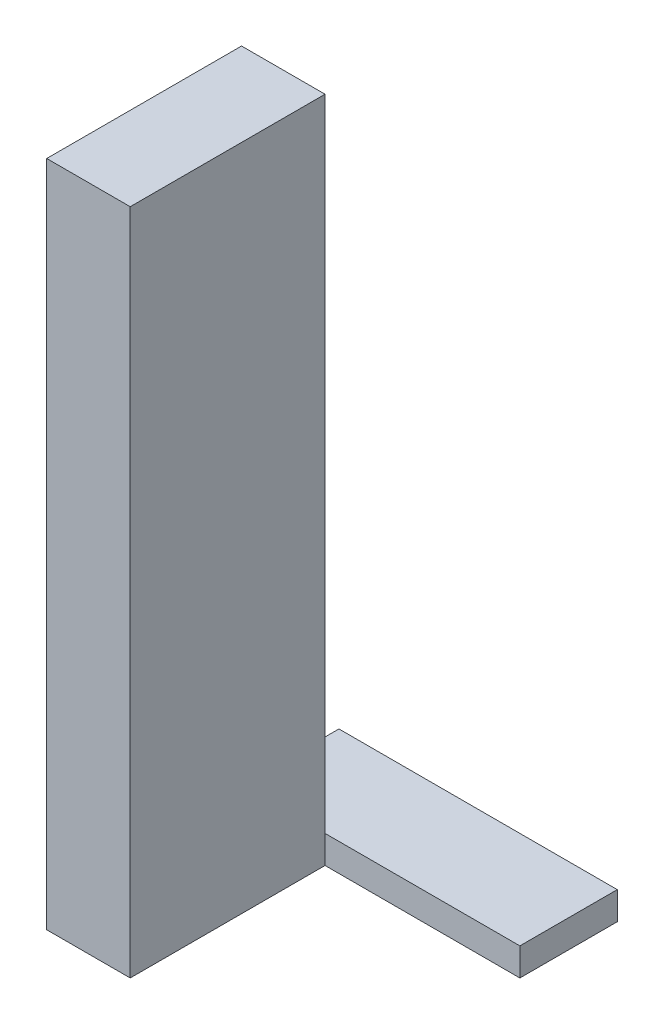
ISO-10303-21;
HEADER;
FILE_DESCRIPTION(('STEP AP214'),'2;1');
FILE_NAME('part.step','',(''),(''),'','','');
FILE_SCHEMA(('AUTOMOTIVE_DESIGN { 1 0 10303 214 1 1 1 1 }'));
ENDSEC;
DATA;
#1=APPLICATION_CONTEXT('core data for automotive mechanical design processes');
#2=APPLICATION_PROTOCOL_DEFINITION('international standard','automotive_design',2000,#1);
#3=PRODUCT_CONTEXT('',#1,'mechanical');
#4=PRODUCT('Part','Part','',(#3));
#5=PRODUCT_RELATED_PRODUCT_CATEGORY('part','',(#4));
#6=PRODUCT_DEFINITION_FORMATION('','',#4);
#7=PRODUCT_DEFINITION_CONTEXT('part definition',#1,'design');
#8=PRODUCT_DEFINITION('design','',#6,#7);
#9=PRODUCT_DEFINITION_SHAPE('','',#8);
#10=(LENGTH_UNIT() NAMED_UNIT(*) SI_UNIT(.MILLI.,.METRE.));
#11=(NAMED_UNIT(*) PLANE_ANGLE_UNIT() SI_UNIT($,.RADIAN.));
#12=(NAMED_UNIT(*) SI_UNIT($,.STERADIAN.) SOLID_ANGLE_UNIT());
#13=UNCERTAINTY_MEASURE_WITH_UNIT(LENGTH_MEASURE(1.E-05),#10,'distance_accuracy_value','');
#14=(GEOMETRIC_REPRESENTATION_CONTEXT(3) GLOBAL_UNCERTAINTY_ASSIGNED_CONTEXT((#13)) GLOBAL_UNIT_ASSIGNED_CONTEXT((#10,
#11,#12)) REPRESENTATION_CONTEXT('',''));
#15=CARTESIAN_POINT('',(0.,0.,0.));
#16=DIRECTION('',(0.,0.,1.));
#17=DIRECTION('',(1.,0.,0.));
#18=AXIS2_PLACEMENT_3D('',#15,#16,#17);
#19=CARTESIAN_POINT('',(40.,390.,484.));
#20=DIRECTION('',(0.,0.,-1.));
#21=DIRECTION('',(-1.,0.,0.));
#22=AXIS2_PLACEMENT_3D('',#19,#20,#21);
#23=PLANE('',#22);
#24=DIRECTION('',(0.,-1.,0.));
#25=VECTOR('',#24,1.);
#26=CARTESIAN_POINT('',(0.,390.,484.));
#27=LINE('',#26,#25);
#28=CARTESIAN_POINT('',(0.,394.,484.));
#29=VERTEX_POINT('',#28);
#30=CARTESIAN_POINT('',(0.,390.,484.));
#31=VERTEX_POINT('',#30);
#32=EDGE_CURVE('E112',#29,#31,#27,.T.);
#33=ORIENTED_EDGE('',*,*,#32,.T.);
#34=DIRECTION('',(-1.,0.,0.));
#35=VECTOR('',#34,1.);
#36=CARTESIAN_POINT('',(40.,390.,484.));
#37=LINE('',#36,#35);
#38=CARTESIAN_POINT('',(40.,390.,484.));
#39=VERTEX_POINT('',#38);
#40=EDGE_CURVE('E12',#39,#31,#37,.T.);
#41=ORIENTED_EDGE('',*,*,#40,.F.);
#42=DIRECTION('',(0.,-1.,0.));
#43=VECTOR('',#42,1.);
#44=CARTESIAN_POINT('',(40.,390.,484.));
#45=LINE('',#44,#43);
#46=CARTESIAN_POINT('',(40.,394.,484.));
#47=VERTEX_POINT('',#46);
#48=EDGE_CURVE('E100',#47,#39,#45,.T.);
#49=ORIENTED_EDGE('',*,*,#48,.F.);
#50=DIRECTION('',(-1.,0.,0.));
#51=VECTOR('',#50,1.);
#52=CARTESIAN_POINT('',(40.,394.,484.));
#53=LINE('',#52,#51);
#54=EDGE_CURVE('E108',#47,#29,#53,.T.);
#55=ORIENTED_EDGE('',*,*,#54,.T.);
#56=EDGE_LOOP('',(#33,#41,#49,#55));
#57=FACE_BOUND('',#56,.T.);
#58=ADVANCED_FACE('F49',(#57),#23,.F.);
#59=CARTESIAN_POINT('',(40.,390.,470.));
#60=DIRECTION('',(0.,1.,0.));
#61=DIRECTION('',(0.,0.,1.));
#62=AXIS2_PLACEMENT_3D('',#59,#60,#61);
#63=PLANE('',#62);
#64=DIRECTION('',(0.,0.,-1.));
#65=VECTOR('',#64,1.);
#66=CARTESIAN_POINT('',(0.,390.,470.));
#67=LINE('',#66,#65);
#68=CARTESIAN_POINT('',(0.,390.,470.));
#69=VERTEX_POINT('',#68);
#70=EDGE_CURVE('E104',#31,#69,#67,.T.);
#71=ORIENTED_EDGE('',*,*,#70,.T.);
#72=DIRECTION('',(-1.,0.,0.));
#73=VECTOR('',#72,1.);
#74=CARTESIAN_POINT('',(40.,390.,470.));
#75=LINE('',#74,#73);
#76=CARTESIAN_POINT('',(40.,390.,470.));
#77=VERTEX_POINT('',#76);
#78=EDGE_CURVE('E57',#77,#69,#75,.T.);
#79=ORIENTED_EDGE('',*,*,#78,.F.);
#80=DIRECTION('',(0.,0.,-1.));
#81=VECTOR('',#80,1.);
#82=CARTESIAN_POINT('',(40.,390.,470.));
#83=LINE('',#82,#81);
#84=EDGE_CURVE('E95',#39,#77,#83,.T.);
#85=ORIENTED_EDGE('',*,*,#84,.F.);
#86=ORIENTED_EDGE('',*,*,#40,.T.);
#87=EDGE_LOOP('',(#71,#79,#85,#86));
#88=FACE_BOUND('',#87,.T.);
#89=ADVANCED_FACE('F103',(#88),#63,.F.);
#90=CARTESIAN_POINT('',(40.,390.,470.));
#91=DIRECTION('',(0.,0.,1.));
#92=DIRECTION('',(1.,0.,0.));
#93=AXIS2_PLACEMENT_3D('',#90,#91,#92);
#94=PLANE('',#93);
#95=DIRECTION('',(0.,1.,0.));
#96=VECTOR('',#95,1.);
#97=CARTESIAN_POINT('',(0.,390.,470.));
#98=LINE('',#97,#96);
#99=CARTESIAN_POINT('',(0.,394.,470.));
#100=VERTEX_POINT('',#99);
#101=EDGE_CURVE('E82',#69,#100,#98,.T.);
#102=ORIENTED_EDGE('',*,*,#101,.T.);
#103=DIRECTION('',(-1.,0.,0.));
#104=VECTOR('',#103,1.);
#105=CARTESIAN_POINT('',(40.,394.,470.));
#106=LINE('',#105,#104);
#107=CARTESIAN_POINT('',(40.,394.,470.));
#108=VERTEX_POINT('',#107);
#109=EDGE_CURVE('E105',#108,#100,#106,.T.);
#110=ORIENTED_EDGE('',*,*,#109,.F.);
#111=DIRECTION('',(0.,1.,0.));
#112=VECTOR('',#111,1.);
#113=CARTESIAN_POINT('',(40.,390.,470.));
#114=LINE('',#113,#112);
#115=EDGE_CURVE('E98',#77,#108,#114,.T.);
#116=ORIENTED_EDGE('',*,*,#115,.F.);
#117=ORIENTED_EDGE('',*,*,#78,.T.);
#118=EDGE_LOOP('',(#102,#110,#116,#117));
#119=FACE_BOUND('',#118,.T.);
#120=ADVANCED_FACE('F106',(#119),#94,.F.);
#121=CARTESIAN_POINT('',(40.,394.,470.));
#122=DIRECTION('',(0.,-1.,0.));
#123=DIRECTION('',(0.,0.,-1.));
#124=AXIS2_PLACEMENT_3D('',#121,#122,#123);
#125=PLANE('',#124);
#126=DIRECTION('',(0.,0.,1.));
#127=VECTOR('',#126,1.);
#128=CARTESIAN_POINT('',(0.,394.,470.));
#129=LINE('',#128,#127);
#130=EDGE_CURVE('E88',#100,#29,#129,.T.);
#131=ORIENTED_EDGE('',*,*,#130,.T.);
#132=ORIENTED_EDGE('',*,*,#54,.F.);
#133=DIRECTION('',(0.,0.,1.));
#134=VECTOR('',#133,1.);
#135=CARTESIAN_POINT('',(40.,394.,470.));
#136=LINE('',#135,#134);
#137=EDGE_CURVE('E65',#108,#47,#136,.T.);
#138=ORIENTED_EDGE('',*,*,#137,.F.);
#139=ORIENTED_EDGE('',*,*,#109,.T.);
#140=EDGE_LOOP('',(#131,#132,#138,#139));
#141=FACE_BOUND('',#140,.T.);
#142=ADVANCED_FACE('F119',(#141),#125,.F.);
#143=CARTESIAN_POINT('',(40.,0.,0.));
#144=DIRECTION('',(1.,0.,0.));
#145=DIRECTION('',(0.,0.,-1.));
#146=AXIS2_PLACEMENT_3D('',#143,#144,#145);
#147=PLANE('',#146);
#148=ORIENTED_EDGE('',*,*,#48,.T.);
#149=ORIENTED_EDGE('',*,*,#84,.T.);
#150=ORIENTED_EDGE('',*,*,#115,.T.);
#151=ORIENTED_EDGE('',*,*,#137,.T.);
#152=EDGE_LOOP('',(#148,#149,#150,#151));
#153=FACE_BOUND('',#152,.T.);
#154=ADVANCED_FACE('F96',(#153),#147,.T.);
#155=CARTESIAN_POINT('',(0.,0.,0.));
#156=DIRECTION('',(1.,0.,0.));
#157=DIRECTION('',(0.,0.,-1.));
#158=AXIS2_PLACEMENT_3D('',#155,#156,#157);
#159=PLANE('',#158);
#160=ORIENTED_EDGE('',*,*,#32,.F.);
#161=ORIENTED_EDGE('',*,*,#130,.F.);
#162=ORIENTED_EDGE('',*,*,#101,.F.);
#163=ORIENTED_EDGE('',*,*,#70,.F.);
#164=EDGE_LOOP('',(#160,#161,#162,#163));
#165=FACE_BOUND('',#164,.T.);
#166=ADVANCED_FACE('F122',(#165),#159,.F.);
#167=CLOSED_SHELL('',(#58,#89,#120,#142,#154,#166));
#168=MANIFOLD_SOLID_BREP('B2',#167);
#169=CARTESIAN_POINT('',(12.,390.,512.));
#170=DIRECTION('',(0.,0.,-1.));
#171=DIRECTION('',(-1.,0.,0.));
#172=AXIS2_PLACEMENT_3D('',#169,#170,#171);
#173=PLANE('',#172);
#174=DIRECTION('',(0.,-1.,0.));
#175=VECTOR('',#174,1.);
#176=CARTESIAN_POINT('',(0.,390.,512.));
#177=LINE('',#176,#175);
#178=CARTESIAN_POINT('',(0.,486.,512.));
#179=VERTEX_POINT('',#178);
#180=CARTESIAN_POINT('',(0.,390.,512.));
#181=VERTEX_POINT('',#180);
#182=EDGE_CURVE('E236',#179,#181,#177,.T.);
#183=ORIENTED_EDGE('',*,*,#182,.T.);
#184=DIRECTION('',(-1.,0.,0.));
#185=VECTOR('',#184,1.);
#186=CARTESIAN_POINT('',(12.,390.,512.));
#187=LINE('',#186,#185);
#188=CARTESIAN_POINT('',(12.,390.,512.));
#189=VERTEX_POINT('',#188);
#190=EDGE_CURVE('E47',#189,#181,#187,.T.);
#191=ORIENTED_EDGE('',*,*,#190,.F.);
#192=DIRECTION('',(0.,-1.,0.));
#193=VECTOR('',#192,1.);
#194=CARTESIAN_POINT('',(12.,390.,512.));
#195=LINE('',#194,#193);
#196=CARTESIAN_POINT('',(12.,486.,512.));
#197=VERTEX_POINT('',#196);
#198=EDGE_CURVE('E224',#197,#189,#195,.T.);
#199=ORIENTED_EDGE('',*,*,#198,.F.);
#200=DIRECTION('',(-1.,0.,0.));
#201=VECTOR('',#200,1.);
#202=CARTESIAN_POINT('',(12.,486.,512.));
#203=LINE('',#202,#201);
#204=EDGE_CURVE('E232',#197,#179,#203,.T.);
#205=ORIENTED_EDGE('',*,*,#204,.T.);
#206=EDGE_LOOP('',(#183,#191,#199,#205));
#207=FACE_BOUND('',#206,.T.);
#208=ADVANCED_FACE('F173',(#207),#173,.F.);
#209=CARTESIAN_POINT('',(12.,390.,484.));
#210=DIRECTION('',(0.,1.,0.));
#211=DIRECTION('',(0.,0.,1.));
#212=AXIS2_PLACEMENT_3D('',#209,#210,#211);
#213=PLANE('',#212);
#214=DIRECTION('',(0.,0.,-1.));
#215=VECTOR('',#214,1.);
#216=CARTESIAN_POINT('',(0.,390.,484.));
#217=LINE('',#216,#215);
#218=CARTESIAN_POINT('',(0.,390.,484.));
#219=VERTEX_POINT('',#218);
#220=EDGE_CURVE('E228',#181,#219,#217,.T.);
#221=ORIENTED_EDGE('',*,*,#220,.T.);
#222=DIRECTION('',(-1.,0.,0.));
#223=VECTOR('',#222,1.);
#224=CARTESIAN_POINT('',(12.,390.,484.));
#225=LINE('',#224,#223);
#226=CARTESIAN_POINT('',(12.,390.,484.));
#227=VERTEX_POINT('',#226);
#228=EDGE_CURVE('E181',#227,#219,#225,.T.);
#229=ORIENTED_EDGE('',*,*,#228,.F.);
#230=DIRECTION('',(0.,0.,-1.));
#231=VECTOR('',#230,1.);
#232=CARTESIAN_POINT('',(12.,390.,484.));
#233=LINE('',#232,#231);
#234=EDGE_CURVE('E219',#189,#227,#233,.T.);
#235=ORIENTED_EDGE('',*,*,#234,.F.);
#236=ORIENTED_EDGE('',*,*,#190,.T.);
#237=EDGE_LOOP('',(#221,#229,#235,#236));
#238=FACE_BOUND('',#237,.T.);
#239=ADVANCED_FACE('F227',(#238),#213,.F.);
#240=CARTESIAN_POINT('',(12.,390.,484.));
#241=DIRECTION('',(0.,0.,1.));
#242=DIRECTION('',(1.,0.,0.));
#243=AXIS2_PLACEMENT_3D('',#240,#241,#242);
#244=PLANE('',#243);
#245=DIRECTION('',(0.,1.,0.));
#246=VECTOR('',#245,1.);
#247=CARTESIAN_POINT('',(0.,390.,484.));
#248=LINE('',#247,#246);
#249=CARTESIAN_POINT('',(0.,486.,484.));
#250=VERTEX_POINT('',#249);
#251=EDGE_CURVE('E206',#219,#250,#248,.T.);
#252=ORIENTED_EDGE('',*,*,#251,.T.);
#253=DIRECTION('',(-1.,0.,0.));
#254=VECTOR('',#253,1.);
#255=CARTESIAN_POINT('',(12.,486.,484.));
#256=LINE('',#255,#254);
#257=CARTESIAN_POINT('',(12.,486.,484.));
#258=VERTEX_POINT('',#257);
#259=EDGE_CURVE('E229',#258,#250,#256,.T.);
#260=ORIENTED_EDGE('',*,*,#259,.F.);
#261=DIRECTION('',(0.,1.,0.));
#262=VECTOR('',#261,1.);
#263=CARTESIAN_POINT('',(12.,390.,484.));
#264=LINE('',#263,#262);
#265=EDGE_CURVE('E222',#227,#258,#264,.T.);
#266=ORIENTED_EDGE('',*,*,#265,.F.);
#267=ORIENTED_EDGE('',*,*,#228,.T.);
#268=EDGE_LOOP('',(#252,#260,#266,#267));
#269=FACE_BOUND('',#268,.T.);
#270=ADVANCED_FACE('F230',(#269),#244,.F.);
#271=CARTESIAN_POINT('',(12.,486.,484.));
#272=DIRECTION('',(0.,-1.,0.));
#273=DIRECTION('',(0.,0.,-1.));
#274=AXIS2_PLACEMENT_3D('',#271,#272,#273);
#275=PLANE('',#274);
#276=DIRECTION('',(0.,0.,1.));
#277=VECTOR('',#276,1.);
#278=CARTESIAN_POINT('',(0.,486.,484.));
#279=LINE('',#278,#277);
#280=EDGE_CURVE('E212',#250,#179,#279,.T.);
#281=ORIENTED_EDGE('',*,*,#280,.T.);
#282=ORIENTED_EDGE('',*,*,#204,.F.);
#283=DIRECTION('',(0.,0.,1.));
#284=VECTOR('',#283,1.);
#285=CARTESIAN_POINT('',(12.,486.,484.));
#286=LINE('',#285,#284);
#287=EDGE_CURVE('E189',#258,#197,#286,.T.);
#288=ORIENTED_EDGE('',*,*,#287,.F.);
#289=ORIENTED_EDGE('',*,*,#259,.T.);
#290=EDGE_LOOP('',(#281,#282,#288,#289));
#291=FACE_BOUND('',#290,.T.);
#292=ADVANCED_FACE('F243',(#291),#275,.F.);
#293=CARTESIAN_POINT('',(12.,0.,0.));
#294=DIRECTION('',(1.,0.,0.));
#295=DIRECTION('',(0.,0.,-1.));
#296=AXIS2_PLACEMENT_3D('',#293,#294,#295);
#297=PLANE('',#296);
#298=ORIENTED_EDGE('',*,*,#198,.T.);
#299=ORIENTED_EDGE('',*,*,#234,.T.);
#300=ORIENTED_EDGE('',*,*,#265,.T.);
#301=ORIENTED_EDGE('',*,*,#287,.T.);
#302=EDGE_LOOP('',(#298,#299,#300,#301));
#303=FACE_BOUND('',#302,.T.);
#304=ADVANCED_FACE('F220',(#303),#297,.T.);
#305=CARTESIAN_POINT('',(0.,0.,0.));
#306=DIRECTION('',(1.,0.,0.));
#307=DIRECTION('',(0.,0.,-1.));
#308=AXIS2_PLACEMENT_3D('',#305,#306,#307);
#309=PLANE('',#308);
#310=ORIENTED_EDGE('',*,*,#182,.F.);
#311=ORIENTED_EDGE('',*,*,#280,.F.);
#312=ORIENTED_EDGE('',*,*,#251,.F.);
#313=ORIENTED_EDGE('',*,*,#220,.F.);
#314=EDGE_LOOP('',(#310,#311,#312,#313));
#315=FACE_BOUND('',#314,.T.);
#316=ADVANCED_FACE('F246',(#315),#309,.F.);
#317=CLOSED_SHELL('',(#208,#239,#270,#292,#304,#316));
#318=MANIFOLD_SOLID_BREP('B6',#317);
#319=ADVANCED_BREP_SHAPE_REPRESENTATION('',(#18,#168,#318),#14);
#320=SHAPE_DEFINITION_REPRESENTATION(#9,#319);
ENDSEC;
END-ISO-10303-21;
